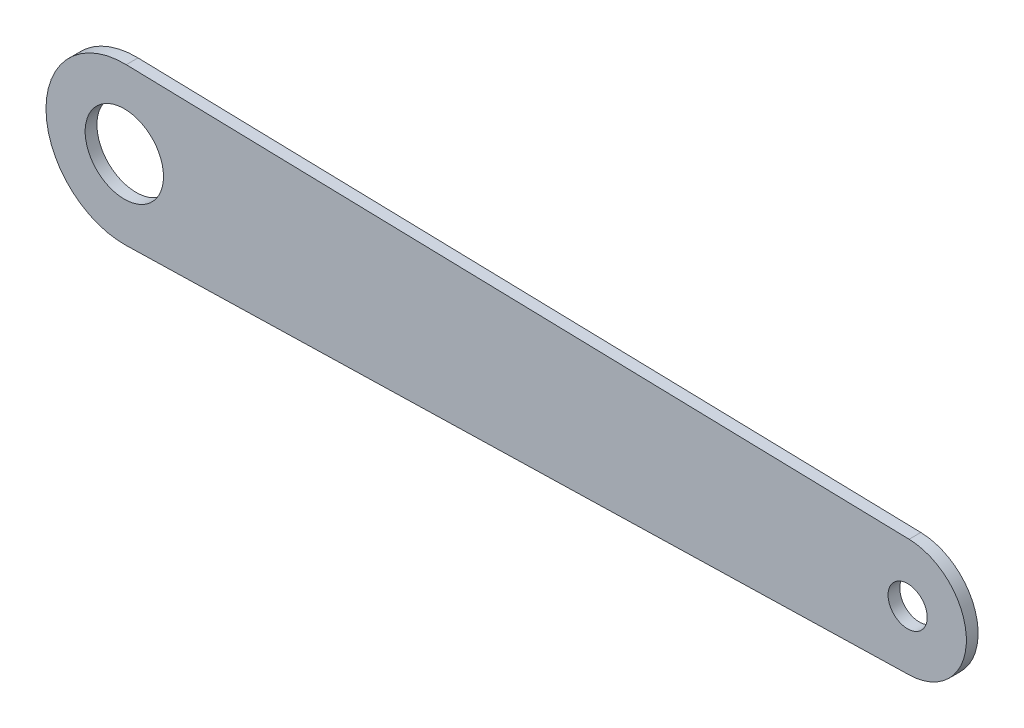
ISO-10303-21;
HEADER;
FILE_DESCRIPTION(('STEP AP214'),'2;1');
FILE_NAME('part.step','',(''),(''),'','','');
FILE_SCHEMA(('AUTOMOTIVE_DESIGN { 1 0 10303 214 1 1 1 1 }'));
ENDSEC;
DATA;
#1=APPLICATION_CONTEXT('core data for automotive mechanical design processes');
#2=APPLICATION_PROTOCOL_DEFINITION('international standard','automotive_design',2000,#1);
#3=PRODUCT_CONTEXT('',#1,'mechanical');
#4=PRODUCT('Part','Part','',(#3));
#5=PRODUCT_RELATED_PRODUCT_CATEGORY('part','',(#4));
#6=PRODUCT_DEFINITION_FORMATION('','',#4);
#7=PRODUCT_DEFINITION_CONTEXT('part definition',#1,'design');
#8=PRODUCT_DEFINITION('design','',#6,#7);
#9=PRODUCT_DEFINITION_SHAPE('','',#8);
#10=(LENGTH_UNIT() NAMED_UNIT(*) SI_UNIT(.MILLI.,.METRE.));
#11=(NAMED_UNIT(*) PLANE_ANGLE_UNIT() SI_UNIT($,.RADIAN.));
#12=(NAMED_UNIT(*) SI_UNIT($,.STERADIAN.) SOLID_ANGLE_UNIT());
#13=UNCERTAINTY_MEASURE_WITH_UNIT(LENGTH_MEASURE(1.E-05),#10,'distance_accuracy_value','');
#14=(GEOMETRIC_REPRESENTATION_CONTEXT(3) GLOBAL_UNCERTAINTY_ASSIGNED_CONTEXT((#13)) GLOBAL_UNIT_ASSIGNED_CONTEXT((#10,
#11,#12)) REPRESENTATION_CONTEXT('',''));
#15=CARTESIAN_POINT('',(0.,0.,0.));
#16=DIRECTION('',(0.,0.,1.));
#17=DIRECTION('',(1.,0.,0.));
#18=AXIS2_PLACEMENT_3D('',#15,#16,#17);
#19=CARTESIAN_POINT('',(0.,0.,3.));
#20=DIRECTION('',(0.,0.,1.));
#21=DIRECTION('',(1.,0.,0.));
#22=AXIS2_PLACEMENT_3D('',#19,#20,#21);
#23=PLANE('',#22);
#24=CARTESIAN_POINT('',(0.,0.,3.));
#25=DIRECTION('',(0.,0.,1.));
#26=DIRECTION('',(1.,0.,0.));
#27=AXIS2_PLACEMENT_3D('',#24,#25,#26);
#28=CIRCLE('',#27,10.);
#29=CARTESIAN_POINT('',(10.,0.,3.));
#30=VERTEX_POINT('',#29);
#31=EDGE_CURVE('E103',#30,#30,#28,.T.);
#32=ORIENTED_EDGE('',*,*,#31,.F.);
#33=EDGE_LOOP('',(#32));
#34=FACE_BOUND('',#33,.T.);
#35=CARTESIAN_POINT('',(0.,0.,3.));
#36=DIRECTION('',(0.,0.,1.));
#37=DIRECTION('',(1.,0.,0.));
#38=AXIS2_PLACEMENT_3D('',#35,#36,#37);
#39=CIRCLE('',#38,20.);
#40=CARTESIAN_POINT('',(0.5,19.9937490231322,3.));
#41=VERTEX_POINT('',#40);
#42=CARTESIAN_POINT('',(0.5,-19.9937490231322,3.));
#43=VERTEX_POINT('',#42);
#44=EDGE_CURVE('E88',#41,#43,#39,.T.);
#45=ORIENTED_EDGE('',*,*,#44,.T.);
#46=DIRECTION('',(0.99968745115661,0.025,0.));
#47=VECTOR('',#46,1.);
#48=CARTESIAN_POINT('',(200.375,-14.9953117673492,3.));
#49=LINE('',#48,#47);
#50=CARTESIAN_POINT('',(200.375,-14.9953117673492,3.));
#51=VERTEX_POINT('',#50);
#52=EDGE_CURVE('E83',#43,#51,#49,.T.);
#53=ORIENTED_EDGE('',*,*,#52,.T.);
#54=CARTESIAN_POINT('',(200.,0.,3.));
#55=DIRECTION('',(0.,0.,1.));
#56=DIRECTION('',(1.,0.,0.));
#57=AXIS2_PLACEMENT_3D('',#54,#55,#56);
#58=CIRCLE('',#57,15.);
#59=CARTESIAN_POINT('',(200.375,14.9953117673492,3.));
#60=VERTEX_POINT('',#59);
#61=EDGE_CURVE('E86',#51,#60,#58,.T.);
#62=ORIENTED_EDGE('',*,*,#61,.T.);
#63=DIRECTION('',(-0.99968745115661,0.025,0.));
#64=VECTOR('',#63,1.);
#65=CARTESIAN_POINT('',(0.5,19.9937490231322,3.));
#66=LINE('',#65,#64);
#67=EDGE_CURVE('E53',#60,#41,#66,.T.);
#68=ORIENTED_EDGE('',*,*,#67,.T.);
#69=EDGE_LOOP('',(#45,#53,#62,#68));
#70=FACE_BOUND('',#69,.T.);
#71=CARTESIAN_POINT('',(200.,0.,3.));
#72=DIRECTION('',(0.,0.,1.));
#73=DIRECTION('',(1.,0.,0.));
#74=AXIS2_PLACEMENT_3D('',#71,#72,#73);
#75=CIRCLE('',#74,4.99999999999999);
#76=CARTESIAN_POINT('',(205.,0.,3.));
#77=VERTEX_POINT('',#76);
#78=EDGE_CURVE('E118',#77,#77,#75,.T.);
#79=ORIENTED_EDGE('',*,*,#78,.F.);
#80=EDGE_LOOP('',(#79));
#81=FACE_BOUND('',#80,.T.);
#82=ADVANCED_FACE('F36',(#34,#70,#81),#23,.T.);
#83=CARTESIAN_POINT('',(0.,0.,0.));
#84=DIRECTION('',(0.,0.,1.));
#85=DIRECTION('',(1.,0.,0.));
#86=AXIS2_PLACEMENT_3D('',#83,#84,#85);
#87=PLANE('',#86);
#88=CARTESIAN_POINT('',(0.,0.,0.));
#89=DIRECTION('',(0.,0.,1.));
#90=DIRECTION('',(1.,0.,0.));
#91=AXIS2_PLACEMENT_3D('',#88,#89,#90);
#92=CIRCLE('',#91,20.);
#93=CARTESIAN_POINT('',(0.5,19.9937490231322,0.));
#94=VERTEX_POINT('',#93);
#95=CARTESIAN_POINT('',(0.5,-19.9937490231322,0.));
#96=VERTEX_POINT('',#95);
#97=EDGE_CURVE('E100',#94,#96,#92,.T.);
#98=ORIENTED_EDGE('',*,*,#97,.F.);
#99=DIRECTION('',(-0.99968745115661,0.025,0.));
#100=VECTOR('',#99,1.);
#101=CARTESIAN_POINT('',(0.5,19.9937490231322,0.));
#102=LINE('',#101,#100);
#103=CARTESIAN_POINT('',(200.375,14.9953117673492,0.));
#104=VERTEX_POINT('',#103);
#105=EDGE_CURVE('E76',#104,#94,#102,.T.);
#106=ORIENTED_EDGE('',*,*,#105,.F.);
#107=CARTESIAN_POINT('',(200.,0.,0.));
#108=DIRECTION('',(0.,0.,1.));
#109=DIRECTION('',(1.,0.,0.));
#110=AXIS2_PLACEMENT_3D('',#107,#108,#109);
#111=CIRCLE('',#110,15.);
#112=CARTESIAN_POINT('',(200.375,-14.9953117673492,0.));
#113=VERTEX_POINT('',#112);
#114=EDGE_CURVE('E70',#113,#104,#111,.T.);
#115=ORIENTED_EDGE('',*,*,#114,.F.);
#116=DIRECTION('',(0.99968745115661,0.025,0.));
#117=VECTOR('',#116,1.);
#118=CARTESIAN_POINT('',(200.375,-14.9953117673492,0.));
#119=LINE('',#118,#117);
#120=EDGE_CURVE('E92',#96,#113,#119,.T.);
#121=ORIENTED_EDGE('',*,*,#120,.F.);
#122=EDGE_LOOP('',(#98,#106,#115,#121));
#123=FACE_BOUND('',#122,.T.);
#124=CARTESIAN_POINT('',(0.,0.,0.));
#125=DIRECTION('',(0.,0.,1.));
#126=DIRECTION('',(1.,0.,0.));
#127=AXIS2_PLACEMENT_3D('',#124,#125,#126);
#128=CIRCLE('',#127,10.);
#129=CARTESIAN_POINT('',(10.,0.,0.));
#130=VERTEX_POINT('',#129);
#131=EDGE_CURVE('E115',#130,#130,#128,.T.);
#132=ORIENTED_EDGE('',*,*,#131,.T.);
#133=EDGE_LOOP('',(#132));
#134=FACE_BOUND('',#133,.T.);
#135=CARTESIAN_POINT('',(200.,0.,0.));
#136=DIRECTION('',(0.,0.,1.));
#137=DIRECTION('',(1.,0.,0.));
#138=AXIS2_PLACEMENT_3D('',#135,#136,#137);
#139=CIRCLE('',#138,4.99999999999999);
#140=CARTESIAN_POINT('',(205.,0.,0.));
#141=VERTEX_POINT('',#140);
#142=EDGE_CURVE('E121',#141,#141,#139,.T.);
#143=ORIENTED_EDGE('',*,*,#142,.T.);
#144=EDGE_LOOP('',(#143));
#145=FACE_BOUND('',#144,.T.);
#146=ADVANCED_FACE('F111',(#123,#134,#145),#87,.F.);
#147=CARTESIAN_POINT('',(0.,0.,3.));
#148=DIRECTION('',(0.,0.,-1.));
#149=DIRECTION('',(-1.,0.,0.));
#150=AXIS2_PLACEMENT_3D('',#147,#148,#149);
#151=CYLINDRICAL_SURFACE('',#150,20.);
#152=ORIENTED_EDGE('',*,*,#97,.T.);
#153=DIRECTION('',(0.,0.,-1.));
#154=VECTOR('',#153,1.);
#155=CARTESIAN_POINT('',(0.5,-19.9937490231322,3.));
#156=LINE('',#155,#154);
#157=EDGE_CURVE('E11',#43,#96,#156,.T.);
#158=ORIENTED_EDGE('',*,*,#157,.F.);
#159=ORIENTED_EDGE('',*,*,#44,.F.);
#160=DIRECTION('',(0.,0.,-1.));
#161=VECTOR('',#160,1.);
#162=CARTESIAN_POINT('',(0.5,19.9937490231322,3.));
#163=LINE('',#162,#161);
#164=EDGE_CURVE('E96',#41,#94,#163,.T.);
#165=ORIENTED_EDGE('',*,*,#164,.T.);
#166=EDGE_LOOP('',(#152,#158,#159,#165));
#167=FACE_BOUND('',#166,.T.);
#168=ADVANCED_FACE('F38',(#167),#151,.T.);
#169=CARTESIAN_POINT('',(200.375,-14.9953117673492,3.));
#170=DIRECTION('',(-0.025,0.99968745115661,0.));
#171=DIRECTION('',(-0.99968745115661,-0.025,0.));
#172=AXIS2_PLACEMENT_3D('',#169,#170,#171);
#173=PLANE('',#172);
#174=ORIENTED_EDGE('',*,*,#120,.T.);
#175=DIRECTION('',(0.,0.,-1.));
#176=VECTOR('',#175,1.);
#177=CARTESIAN_POINT('',(200.375,-14.9953117673492,3.));
#178=LINE('',#177,#176);
#179=EDGE_CURVE('E45',#51,#113,#178,.T.);
#180=ORIENTED_EDGE('',*,*,#179,.F.);
#181=ORIENTED_EDGE('',*,*,#52,.F.);
#182=ORIENTED_EDGE('',*,*,#157,.T.);
#183=EDGE_LOOP('',(#174,#180,#181,#182));
#184=FACE_BOUND('',#183,.T.);
#185=ADVANCED_FACE('F91',(#184),#173,.F.);
#186=CARTESIAN_POINT('',(200.,0.,3.));
#187=DIRECTION('',(0.,0.,-1.));
#188=DIRECTION('',(-1.,0.,0.));
#189=AXIS2_PLACEMENT_3D('',#186,#187,#188);
#190=CYLINDRICAL_SURFACE('',#189,15.);
#191=ORIENTED_EDGE('',*,*,#114,.T.);
#192=DIRECTION('',(0.,0.,-1.));
#193=VECTOR('',#192,1.);
#194=CARTESIAN_POINT('',(200.375,14.9953117673492,3.));
#195=LINE('',#194,#193);
#196=EDGE_CURVE('E93',#60,#104,#195,.T.);
#197=ORIENTED_EDGE('',*,*,#196,.F.);
#198=ORIENTED_EDGE('',*,*,#61,.F.);
#199=ORIENTED_EDGE('',*,*,#179,.T.);
#200=EDGE_LOOP('',(#191,#197,#198,#199));
#201=FACE_BOUND('',#200,.T.);
#202=ADVANCED_FACE('F94',(#201),#190,.T.);
#203=CARTESIAN_POINT('',(0.5,19.9937490231322,3.));
#204=DIRECTION('',(-0.025,-0.99968745115661,0.));
#205=DIRECTION('',(0.99968745115661,-0.025,0.));
#206=AXIS2_PLACEMENT_3D('',#203,#204,#205);
#207=PLANE('',#206);
#208=ORIENTED_EDGE('',*,*,#105,.T.);
#209=ORIENTED_EDGE('',*,*,#164,.F.);
#210=ORIENTED_EDGE('',*,*,#67,.F.);
#211=ORIENTED_EDGE('',*,*,#196,.T.);
#212=EDGE_LOOP('',(#208,#209,#210,#211));
#213=FACE_BOUND('',#212,.T.);
#214=ADVANCED_FACE('F108',(#213),#207,.F.);
#215=CARTESIAN_POINT('',(0.,0.,3.));
#216=DIRECTION('',(0.,0.,-1.));
#217=DIRECTION('',(-1.,0.,0.));
#218=AXIS2_PLACEMENT_3D('',#215,#216,#217);
#219=CYLINDRICAL_SURFACE('',#218,10.);
#220=ORIENTED_EDGE('',*,*,#31,.T.);
#221=EDGE_LOOP('',(#220));
#222=FACE_BOUND('',#221,.T.);
#223=ORIENTED_EDGE('',*,*,#131,.F.);
#224=EDGE_LOOP('',(#223));
#225=FACE_BOUND('',#224,.T.);
#226=ADVANCED_FACE('F138',(#222,#225),#219,.F.);
#227=CARTESIAN_POINT('',(200.,0.,3.));
#228=DIRECTION('',(0.,0.,-1.));
#229=DIRECTION('',(-1.,0.,0.));
#230=AXIS2_PLACEMENT_3D('',#227,#228,#229);
#231=CYLINDRICAL_SURFACE('',#230,4.99999999999999);
#232=ORIENTED_EDGE('',*,*,#78,.T.);
#233=EDGE_LOOP('',(#232));
#234=FACE_BOUND('',#233,.T.);
#235=ORIENTED_EDGE('',*,*,#142,.F.);
#236=EDGE_LOOP('',(#235));
#237=FACE_BOUND('',#236,.T.);
#238=ADVANCED_FACE('F127',(#234,#237),#231,.F.);
#239=CLOSED_SHELL('',(#82,#146,#168,#185,#202,#214,#226,#238));
#240=MANIFOLD_SOLID_BREP('B2',#239);
#241=ADVANCED_BREP_SHAPE_REPRESENTATION('',(#18,#240),#14);
#242=SHAPE_DEFINITION_REPRESENTATION(#9,#241);
ENDSEC;
END-ISO-10303-21;
